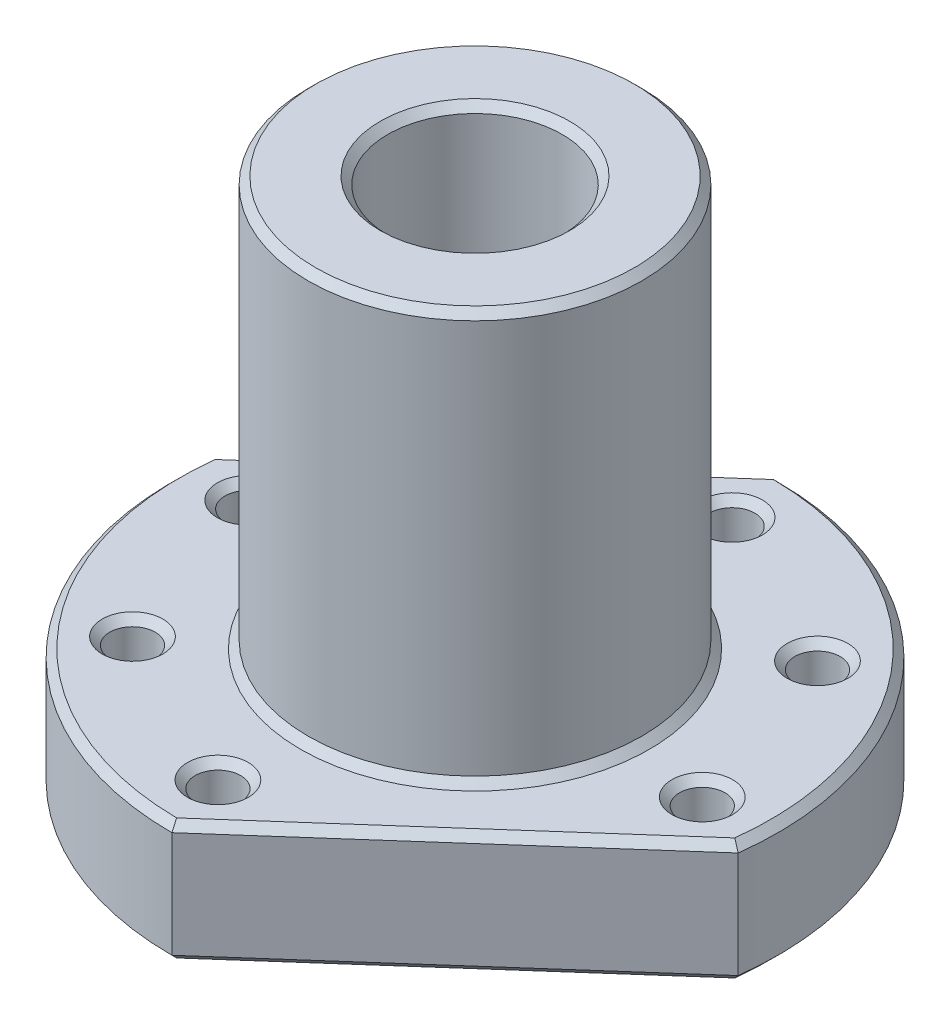
ISO-10303-21;
HEADER;
FILE_DESCRIPTION(('STEP AP214'),'2;1');
FILE_NAME('part.step','',(''),(''),'','','');
FILE_SCHEMA(('AUTOMOTIVE_DESIGN { 1 0 10303 214 1 1 1 1 }'));
ENDSEC;
DATA;
#1=APPLICATION_CONTEXT('core data for automotive mechanical design processes');
#2=APPLICATION_PROTOCOL_DEFINITION('international standard','automotive_design',2000,#1);
#3=PRODUCT_CONTEXT('',#1,'mechanical');
#4=PRODUCT('Part','Part','',(#3));
#5=PRODUCT_RELATED_PRODUCT_CATEGORY('part','',(#4));
#6=PRODUCT_DEFINITION_FORMATION('','',#4);
#7=PRODUCT_DEFINITION_CONTEXT('part definition',#1,'design');
#8=PRODUCT_DEFINITION('design','',#6,#7);
#9=PRODUCT_DEFINITION_SHAPE('','',#8);
#10=(LENGTH_UNIT() NAMED_UNIT(*) SI_UNIT(.MILLI.,.METRE.));
#11=(NAMED_UNIT(*) PLANE_ANGLE_UNIT() SI_UNIT($,.RADIAN.));
#12=(NAMED_UNIT(*) SI_UNIT($,.STERADIAN.) SOLID_ANGLE_UNIT());
#13=UNCERTAINTY_MEASURE_WITH_UNIT(LENGTH_MEASURE(1.E-05),#10,'distance_accuracy_value','');
#14=(GEOMETRIC_REPRESENTATION_CONTEXT(3) GLOBAL_UNCERTAINTY_ASSIGNED_CONTEXT((#13)) GLOBAL_UNIT_ASSIGNED_CONTEXT((#10,
#11,#12)) REPRESENTATION_CONTEXT('',''));
#15=CARTESIAN_POINT('',(0.,0.,0.));
#16=DIRECTION('',(0.,0.,1.));
#17=DIRECTION('',(1.,0.,0.));
#18=AXIS2_PLACEMENT_3D('',#15,#16,#17);
#19=CARTESIAN_POINT('',(0.,8.,0.));
#20=DIRECTION('',(0.,1.,0.));
#21=DIRECTION('',(0.,0.,1.));
#22=AXIS2_PLACEMENT_3D('',#19,#20,#21);
#23=PLANE('',#22);
#24=DIRECTION('',(-0.749599603554086,0.,0.661891557848835));
#25=VECTOR('',#24,1.);
#26=CARTESIAN_POINT('',(-19.5136982581917,8.,-2.11319196672854));
#27=LINE('',#26,#25);
#28=CARTESIAN_POINT('',(0.176155488049384,8.,-19.4992043233571));
#29=VERTEX_POINT('',#28);
#30=CARTESIAN_POINT('',(-19.3710106656656,8.,-2.23918417971134));
#31=VERTEX_POINT('',#30);
#32=EDGE_CURVE('E55',#29,#31,#27,.T.);
#33=ORIENTED_EDGE('',*,*,#32,.T.);
#34=CARTESIAN_POINT('',(0.,8.,0.));
#35=DIRECTION('',(0.,1.,0.));
#36=DIRECTION('',(0.,0.,1.));
#37=AXIS2_PLACEMENT_3D('',#34,#35,#36);
#38=CIRCLE('',#37,19.5);
#39=CARTESIAN_POINT('',(-0.176155488049398,8.,19.4992043233571));
#40=VERTEX_POINT('',#39);
#41=EDGE_CURVE('E250',#31,#40,#38,.T.);
#42=ORIENTED_EDGE('',*,*,#41,.T.);
#43=DIRECTION('',(0.749599603554086,0.,-0.661891557848835));
#44=VECTOR('',#43,1.);
#45=CARTESIAN_POINT('',(19.5136982581917,8.,2.11319196672854));
#46=LINE('',#45,#44);
#47=CARTESIAN_POINT('',(19.3710106656656,8.,2.23918417971133));
#48=VERTEX_POINT('',#47);
#49=EDGE_CURVE('E246',#40,#48,#46,.T.);
#50=ORIENTED_EDGE('',*,*,#49,.T.);
#51=CARTESIAN_POINT('',(0.,8.,0.));
#52=DIRECTION('',(0.,1.,0.));
#53=DIRECTION('',(0.,0.,1.));
#54=AXIS2_PLACEMENT_3D('',#51,#52,#53);
#55=CIRCLE('',#54,19.5);
#56=EDGE_CURVE('E60',#48,#29,#55,.T.);
#57=ORIENTED_EDGE('',*,*,#56,.T.);
#58=EDGE_LOOP('',(#33,#42,#50,#57));
#59=FACE_BOUND('',#58,.T.);
#60=CARTESIAN_POINT('',(0.,8.,0.));
#61=DIRECTION('',(0.,1.,0.));
#62=DIRECTION('',(0.,0.,1.));
#63=AXIS2_PLACEMENT_3D('',#60,#61,#62);
#64=CIRCLE('',#63,11.5);
#65=CARTESIAN_POINT('',(0.,8.,11.5));
#66=VERTEX_POINT('',#65);
#67=EDGE_CURVE('E243',#66,#66,#64,.F.);
#68=ORIENTED_EDGE('',*,*,#67,.T.);
#69=EDGE_LOOP('',(#68));
#70=FACE_BOUND('',#69,.T.);
#71=CARTESIAN_POINT('',(0.983422310714964,8.,-15.9697489197166));
#72=DIRECTION('',(0.,1.,0.));
#73=DIRECTION('',(0.,0.,1.));
#74=AXIS2_PLACEMENT_3D('',#71,#72,#73);
#75=CIRCLE('',#74,1.99999999999999);
#76=CARTESIAN_POINT('',(0.983422310714964,8.,-13.9697489197166));
#77=VERTEX_POINT('',#76);
#78=EDGE_CURVE('E240',#77,#77,#75,.F.);
#79=ORIENTED_EDGE('',*,*,#78,.T.);
#80=EDGE_LOOP('',(#79));
#81=FACE_BOUND('',#80,.T.);
#82=CARTESIAN_POINT('',(11.987702339655,8.,-10.5969331703019));
#83=DIRECTION('',(0.,1.,0.));
#84=DIRECTION('',(0.,0.,1.));
#85=AXIS2_PLACEMENT_3D('',#82,#83,#84);
#86=CIRCLE('',#85,2.00000000000004);
#87=CARTESIAN_POINT('',(11.987702339655,8.,-8.59693317030186));
#88=VERTEX_POINT('',#87);
#89=EDGE_CURVE('E237',#88,#88,#86,.F.);
#90=ORIENTED_EDGE('',*,*,#89,.T.);
#91=EDGE_LOOP('',(#90));
#92=FACE_BOUND('',#91,.T.);
#93=CARTESIAN_POINT('',(15.9697489197173,8.,0.983422310714324));
#94=DIRECTION('',(0.,1.,0.));
#95=DIRECTION('',(0.,0.,1.));
#96=AXIS2_PLACEMENT_3D('',#93,#94,#95);
#97=CIRCLE('',#96,2.00000000000047);
#98=CARTESIAN_POINT('',(15.9697489197173,8.,2.98342231071479));
#99=VERTEX_POINT('',#98);
#100=EDGE_CURVE('E234',#99,#99,#97,.F.);
#101=ORIENTED_EDGE('',*,*,#100,.T.);
#102=EDGE_LOOP('',(#101));
#103=FACE_BOUND('',#102,.T.);
#104=CARTESIAN_POINT('',(-0.983422310713593,8.,15.9697489197166));
#105=DIRECTION('',(0.,1.,0.));
#106=DIRECTION('',(0.,0.,1.));
#107=AXIS2_PLACEMENT_3D('',#104,#105,#106);
#108=CIRCLE('',#107,2.00000000000139);
#109=CARTESIAN_POINT('',(-0.983422310713593,8.,17.969748919718));
#110=VERTEX_POINT('',#109);
#111=EDGE_CURVE('E231',#110,#110,#108,.F.);
#112=ORIENTED_EDGE('',*,*,#111,.T.);
#113=EDGE_LOOP('',(#112));
#114=FACE_BOUND('',#113,.T.);
#115=CARTESIAN_POINT('',(-11.9877023396537,8.,10.596933170302));
#116=DIRECTION('',(0.,1.,0.));
#117=DIRECTION('',(0.,0.,1.));
#118=AXIS2_PLACEMENT_3D('',#115,#116,#117);
#119=CIRCLE('',#118,2.00000000000141);
#120=CARTESIAN_POINT('',(-11.9877023396537,8.,12.5969331703034));
#121=VERTEX_POINT('',#120);
#122=EDGE_CURVE('E228',#121,#121,#119,.F.);
#123=ORIENTED_EDGE('',*,*,#122,.T.);
#124=EDGE_LOOP('',(#123));
#125=FACE_BOUND('',#124,.T.);
#126=CARTESIAN_POINT('',(-15.9697489197159,8.,-0.983422310714232));
#127=DIRECTION('',(0.,1.,0.));
#128=DIRECTION('',(0.,0.,1.));
#129=AXIS2_PLACEMENT_3D('',#126,#127,#128);
#130=CIRCLE('',#129,2.00000000000106);
#131=CARTESIAN_POINT('',(-15.9697489197159,8.,1.01657768928683));
#132=VERTEX_POINT('',#131);
#133=EDGE_CURVE('E225',#132,#132,#130,.F.);
#134=ORIENTED_EDGE('',*,*,#133,.T.);
#135=EDGE_LOOP('',(#134));
#136=FACE_BOUND('',#135,.T.);
#137=ADVANCED_FACE('F33',(#59,#70,#81,#92,#103,#114,#125,#136),#23,.T.);
#138=CARTESIAN_POINT('',(6.0856107622216,8.,-25.3842375284762));
#139=DIRECTION('',(0.661891557848835,0.,0.749599603554086));
#140=DIRECTION('',(0.749599603554086,0.,-0.661891557848835));
#141=AXIS2_PLACEMENT_3D('',#138,#139,#140);
#142=PLANE('',#141);
#143=DIRECTION('',(0.,1.,0.));
#144=VECTOR('',#143,1.);
#145=CARTESIAN_POINT('',(-0.012102698348929,-19.,-19.999996338117));
#146=LINE('',#145,#144);
#147=CARTESIAN_POINT('',(-0.012102698348929,0.499999999999994,-19.999996338117));
#148=VERTEX_POINT('',#147);
#149=CARTESIAN_POINT('',(-0.012102698348929,7.49999999999999,-19.999996338117));
#150=VERTEX_POINT('',#149);
#151=EDGE_CURVE('E109',#148,#150,#146,.T.);
#152=ORIENTED_EDGE('',*,*,#151,.F.);
#153=DIRECTION('',(-0.749599603554086,0.,0.661891557848835));
#154=VECTOR('',#153,1.);
#155=CARTESIAN_POINT('',(6.0856107622216,0.499999999999995,-25.3842375284762));
#156=LINE('',#155,#154);
#157=CARTESIAN_POINT('',(-19.8446440371161,0.499999999999994,-2.48799176850559));
#158=VERTEX_POINT('',#157);
#159=EDGE_CURVE('E125',#148,#158,#156,.T.);
#160=ORIENTED_EDGE('',*,*,#159,.T.);
#161=DIRECTION('',(0.,1.,0.));
#162=VECTOR('',#161,1.);
#163=CARTESIAN_POINT('',(-19.8446440371161,-19.,-2.48799176850559));
#164=LINE('',#163,#162);
#165=CARTESIAN_POINT('',(-19.8446440371161,7.49999999999999,-2.48799176850559));
#166=VERTEX_POINT('',#165);
#167=EDGE_CURVE('E343',#166,#158,#164,.F.);
#168=ORIENTED_EDGE('',*,*,#167,.F.);
#169=DIRECTION('',(0.749599603554086,0.,-0.661891557848835));
#170=VECTOR('',#169,1.);
#171=CARTESIAN_POINT('',(-0.0121026983489287,7.49999999999999,-19.999996338117));
#172=LINE('',#171,#170);
#173=EDGE_CURVE('E128',#166,#150,#172,.T.);
#174=ORIENTED_EDGE('',*,*,#173,.T.);
#175=EDGE_LOOP('',(#152,#160,#168,#174));
#176=FACE_BOUND('',#175,.T.);
#177=ADVANCED_FACE('F122',(#176),#142,.F.);
#178=CARTESIAN_POINT('',(25.9423574976867,8.,-2.89624942185361));
#179=DIRECTION('',(-0.661891557848835,0.,-0.749599603554086));
#180=DIRECTION('',(-0.749599603554086,0.,0.661891557848835));
#181=AXIS2_PLACEMENT_3D('',#178,#179,#180);
#182=PLANE('',#181);
#183=DIRECTION('',(0.,1.,0.));
#184=VECTOR('',#183,1.);
#185=CARTESIAN_POINT('',(0.0121026983489238,-19.,19.999996338117));
#186=LINE('',#185,#184);
#187=CARTESIAN_POINT('',(0.0121026983489238,0.499999999999994,19.999996338117));
#188=VERTEX_POINT('',#187);
#189=CARTESIAN_POINT('',(0.0121026983489238,7.49999999999998,19.999996338117));
#190=VERTEX_POINT('',#189);
#191=EDGE_CURVE('E290',#188,#190,#186,.T.);
#192=ORIENTED_EDGE('',*,*,#191,.F.);
#193=DIRECTION('',(0.749599603554086,0.,-0.661891557848835));
#194=VECTOR('',#193,1.);
#195=CARTESIAN_POINT('',(25.9423574976867,0.499999999999993,-2.89624942185361));
#196=LINE('',#195,#194);
#197=CARTESIAN_POINT('',(19.8446440371161,0.499999999999994,2.48799176850559));
#198=VERTEX_POINT('',#197);
#199=EDGE_CURVE('E181',#188,#198,#196,.T.);
#200=ORIENTED_EDGE('',*,*,#199,.T.);
#201=DIRECTION('',(0.,1.,0.));
#202=VECTOR('',#201,1.);
#203=CARTESIAN_POINT('',(19.8446440371161,-19.,2.48799176850559));
#204=LINE('',#203,#202);
#205=CARTESIAN_POINT('',(19.8446440371161,7.49999999999998,2.48799176850559));
#206=VERTEX_POINT('',#205);
#207=EDGE_CURVE('E112',#206,#198,#204,.F.);
#208=ORIENTED_EDGE('',*,*,#207,.F.);
#209=DIRECTION('',(-0.749599603554086,0.,0.661891557848835));
#210=VECTOR('',#209,1.);
#211=CARTESIAN_POINT('',(0.0121026983489211,7.49999999999998,19.999996338117));
#212=LINE('',#211,#210);
#213=EDGE_CURVE('E179',#206,#190,#212,.T.);
#214=ORIENTED_EDGE('',*,*,#213,.T.);
#215=EDGE_LOOP('',(#192,#200,#208,#214));
#216=FACE_BOUND('',#215,.T.);
#217=ADVANCED_FACE('F350',(#216),#182,.F.);
#218=CARTESIAN_POINT('',(0.,0.,0.));
#219=DIRECTION('',(0.,1.,0.));
#220=DIRECTION('',(0.,0.,1.));
#221=AXIS2_PLACEMENT_3D('',#218,#219,#220);
#222=PLANE('',#221);
#223=CARTESIAN_POINT('',(0.,0.,0.));
#224=DIRECTION('',(0.,1.,0.));
#225=DIRECTION('',(0.,0.,1.));
#226=AXIS2_PLACEMENT_3D('',#223,#224,#225);
#227=CIRCLE('',#226,19.5);
#228=CARTESIAN_POINT('',(-0.176155488049394,0.,19.4992043233571));
#229=VERTEX_POINT('',#228);
#230=CARTESIAN_POINT('',(-19.3710106656656,0.,-2.23918417971135));
#231=VERTEX_POINT('',#230);
#232=EDGE_CURVE('E170',#229,#231,#227,.F.);
#233=ORIENTED_EDGE('',*,*,#232,.T.);
#234=DIRECTION('',(0.749599603554086,0.,-0.661891557848835));
#235=VECTOR('',#234,1.);
#236=CARTESIAN_POINT('',(-9.59742758880811,0.,-10.8691942515342));
#237=LINE('',#236,#235);
#238=CARTESIAN_POINT('',(0.176155488049382,0.,-19.4992043233571));
#239=VERTEX_POINT('',#238);
#240=EDGE_CURVE('E172',#231,#239,#237,.T.);
#241=ORIENTED_EDGE('',*,*,#240,.T.);
#242=CARTESIAN_POINT('',(0.,0.,0.));
#243=DIRECTION('',(0.,1.,0.));
#244=DIRECTION('',(0.,0.,1.));
#245=AXIS2_PLACEMENT_3D('',#242,#243,#244);
#246=CIRCLE('',#245,19.5);
#247=CARTESIAN_POINT('',(19.3710106656656,0.,2.23918417971134));
#248=VERTEX_POINT('',#247);
#249=EDGE_CURVE('E133',#239,#248,#246,.F.);
#250=ORIENTED_EDGE('',*,*,#249,.T.);
#251=DIRECTION('',(-0.749599603554086,0.,0.661891557848835));
#252=VECTOR('',#251,1.);
#253=CARTESIAN_POINT('',(9.5974275888081,0.,10.8691942515342));
#254=LINE('',#253,#252);
#255=EDGE_CURVE('E168',#248,#229,#254,.T.);
#256=ORIENTED_EDGE('',*,*,#255,.T.);
#257=EDGE_LOOP('',(#233,#241,#250,#256));
#258=FACE_BOUND('',#257,.T.);
#259=CARTESIAN_POINT('',(0.,0.,0.));
#260=DIRECTION('',(0.,1.,0.));
#261=DIRECTION('',(0.,0.,1.));
#262=AXIS2_PLACEMENT_3D('',#259,#260,#261);
#263=CIRCLE('',#262,6.25);
#264=CARTESIAN_POINT('',(0.,0.,6.25));
#265=VERTEX_POINT('',#264);
#266=EDGE_CURVE('E164',#265,#265,#263,.T.);
#267=ORIENTED_EDGE('',*,*,#266,.T.);
#268=EDGE_LOOP('',(#267));
#269=FACE_BOUND('',#268,.T.);
#270=CARTESIAN_POINT('',(0.983422310714964,0.,-15.9697489197166));
#271=DIRECTION('',(0.,1.,0.));
#272=DIRECTION('',(0.,0.,1.));
#273=AXIS2_PLACEMENT_3D('',#270,#271,#272);
#274=CIRCLE('',#273,2.00000000000001);
#275=CARTESIAN_POINT('',(0.983422310714964,0.,-13.9697489197165));
#276=VERTEX_POINT('',#275);
#277=EDGE_CURVE('E161',#276,#276,#274,.T.);
#278=ORIENTED_EDGE('',*,*,#277,.T.);
#279=EDGE_LOOP('',(#278));
#280=FACE_BOUND('',#279,.T.);
#281=CARTESIAN_POINT('',(11.987702339655,0.,-10.5969331703019));
#282=DIRECTION('',(0.,1.,0.));
#283=DIRECTION('',(0.,0.,1.));
#284=AXIS2_PLACEMENT_3D('',#281,#282,#283);
#285=CIRCLE('',#284,2.00000000000004);
#286=CARTESIAN_POINT('',(11.987702339655,0.,-8.59693317030185));
#287=VERTEX_POINT('',#286);
#288=EDGE_CURVE('E158',#287,#287,#285,.T.);
#289=ORIENTED_EDGE('',*,*,#288,.T.);
#290=EDGE_LOOP('',(#289));
#291=FACE_BOUND('',#290,.T.);
#292=CARTESIAN_POINT('',(15.9697489197173,0.,0.983422310714324));
#293=DIRECTION('',(0.,1.,0.));
#294=DIRECTION('',(0.,0.,1.));
#295=AXIS2_PLACEMENT_3D('',#292,#293,#294);
#296=CIRCLE('',#295,2.00000000000046);
#297=CARTESIAN_POINT('',(15.9697489197173,0.,2.98342231071478));
#298=VERTEX_POINT('',#297);
#299=EDGE_CURVE('E155',#298,#298,#296,.T.);
#300=ORIENTED_EDGE('',*,*,#299,.T.);
#301=EDGE_LOOP('',(#300));
#302=FACE_BOUND('',#301,.T.);
#303=CARTESIAN_POINT('',(-0.983422310713593,0.,15.9697489197166));
#304=DIRECTION('',(0.,1.,0.));
#305=DIRECTION('',(0.,0.,1.));
#306=AXIS2_PLACEMENT_3D('',#303,#304,#305);
#307=CIRCLE('',#306,2.00000000000138);
#308=CARTESIAN_POINT('',(-0.983422310713593,0.,17.969748919718));
#309=VERTEX_POINT('',#308);
#310=EDGE_CURVE('E152',#309,#309,#307,.T.);
#311=ORIENTED_EDGE('',*,*,#310,.T.);
#312=EDGE_LOOP('',(#311));
#313=FACE_BOUND('',#312,.T.);
#314=CARTESIAN_POINT('',(-11.9877023396537,0.,10.596933170302));
#315=DIRECTION('',(0.,1.,0.));
#316=DIRECTION('',(0.,0.,1.));
#317=AXIS2_PLACEMENT_3D('',#314,#315,#316);
#318=CIRCLE('',#317,2.00000000000138);
#319=CARTESIAN_POINT('',(-11.9877023396537,0.,12.5969331703034));
#320=VERTEX_POINT('',#319);
#321=EDGE_CURVE('E146',#320,#320,#318,.T.);
#322=ORIENTED_EDGE('',*,*,#321,.T.);
#323=EDGE_LOOP('',(#322));
#324=FACE_BOUND('',#323,.T.);
#325=CARTESIAN_POINT('',(-15.9697489197159,0.,-0.983422310714232));
#326=DIRECTION('',(0.,1.,0.));
#327=DIRECTION('',(0.,0.,1.));
#328=AXIS2_PLACEMENT_3D('',#325,#326,#327);
#329=CIRCLE('',#328,2.00000000000105);
#330=CARTESIAN_POINT('',(-15.9697489197159,0.,1.01657768928682));
#331=VERTEX_POINT('',#330);
#332=EDGE_CURVE('E143',#331,#331,#329,.T.);
#333=ORIENTED_EDGE('',*,*,#332,.T.);
#334=EDGE_LOOP('',(#333));
#335=FACE_BOUND('',#334,.T.);
#336=ADVANCED_FACE('F358',(#258,#269,#280,#291,#302,#313,#324,#335),#222,.F.);
#337=CARTESIAN_POINT('',(0.,35.,0.));
#338=DIRECTION('',(0.,1.,0.));
#339=DIRECTION('',(0.,0.,1.));
#340=AXIS2_PLACEMENT_3D('',#337,#338,#339);
#341=PLANE('',#340);
#342=CARTESIAN_POINT('',(0.,35.,0.));
#343=DIRECTION('',(0.,1.,0.));
#344=DIRECTION('',(0.,0.,1.));
#345=AXIS2_PLACEMENT_3D('',#342,#343,#344);
#346=CIRCLE('',#345,6.24999999999998);
#347=CARTESIAN_POINT('',(0.,35.,6.24999999999998));
#348=VERTEX_POINT('',#347);
#349=EDGE_CURVE('E11',#348,#348,#346,.F.);
#350=ORIENTED_EDGE('',*,*,#349,.T.);
#351=EDGE_LOOP('',(#350));
#352=FACE_BOUND('',#351,.T.);
#353=CARTESIAN_POINT('',(0.,35.,0.));
#354=DIRECTION('',(0.,1.,0.));
#355=DIRECTION('',(0.,0.,1.));
#356=AXIS2_PLACEMENT_3D('',#353,#354,#355);
#357=CIRCLE('',#356,10.5);
#358=CARTESIAN_POINT('',(0.,35.,10.5));
#359=VERTEX_POINT('',#358);
#360=EDGE_CURVE('E47',#359,#359,#357,.T.);
#361=ORIENTED_EDGE('',*,*,#360,.T.);
#362=EDGE_LOOP('',(#361));
#363=FACE_BOUND('',#362,.T.);
#364=ADVANCED_FACE('F361',(#352,#363),#341,.T.);
#365=CARTESIAN_POINT('',(0.,35.,0.));
#366=DIRECTION('',(0.,-1.,0.));
#367=DIRECTION('',(0.,0.,-1.));
#368=AXIS2_PLACEMENT_3D('',#365,#366,#367);
#369=CYLINDRICAL_SURFACE('',#368,11.);
#370=CARTESIAN_POINT('',(0.,8.49999999999999,0.));
#371=DIRECTION('',(0.,1.,0.));
#372=DIRECTION('',(0.,0.,1.));
#373=AXIS2_PLACEMENT_3D('',#370,#371,#372);
#374=CIRCLE('',#373,11.);
#375=CARTESIAN_POINT('',(0.,8.49999999999999,11.));
#376=VERTEX_POINT('',#375);
#377=EDGE_CURVE('E255',#376,#376,#374,.T.);
#378=ORIENTED_EDGE('',*,*,#377,.T.);
#379=EDGE_LOOP('',(#378));
#380=FACE_BOUND('',#379,.T.);
#381=CARTESIAN_POINT('',(0.,34.5,0.));
#382=DIRECTION('',(0.,1.,0.));
#383=DIRECTION('',(0.,0.,1.));
#384=AXIS2_PLACEMENT_3D('',#381,#382,#383);
#385=CIRCLE('',#384,11.);
#386=CARTESIAN_POINT('',(0.,34.5,11.));
#387=VERTEX_POINT('',#386);
#388=EDGE_CURVE('E252',#387,#387,#385,.F.);
#389=ORIENTED_EDGE('',*,*,#388,.T.);
#390=EDGE_LOOP('',(#389));
#391=FACE_BOUND('',#390,.T.);
#392=ADVANCED_FACE('F394',(#380,#391),#369,.T.);
#393=CARTESIAN_POINT('',(0.,35.,0.));
#394=DIRECTION('',(0.,-1.,0.));
#395=DIRECTION('',(0.,0.,-1.));
#396=AXIS2_PLACEMENT_3D('',#393,#394,#395);
#397=CYLINDRICAL_SURFACE('',#396,5.75);
#398=CARTESIAN_POINT('',(0.,0.5,0.));
#399=DIRECTION('',(0.,1.,0.));
#400=DIRECTION('',(0.,0.,1.));
#401=AXIS2_PLACEMENT_3D('',#398,#399,#400);
#402=CIRCLE('',#401,5.75);
#403=CARTESIAN_POINT('',(0.,0.5,5.75));
#404=VERTEX_POINT('',#403);
#405=EDGE_CURVE('E186',#404,#404,#402,.F.);
#406=ORIENTED_EDGE('',*,*,#405,.T.);
#407=EDGE_LOOP('',(#406));
#408=FACE_BOUND('',#407,.T.);
#409=CARTESIAN_POINT('',(0.,34.5,0.));
#410=DIRECTION('',(0.,1.,0.));
#411=DIRECTION('',(0.,0.,1.));
#412=AXIS2_PLACEMENT_3D('',#409,#410,#411);
#413=CIRCLE('',#412,5.75);
#414=CARTESIAN_POINT('',(0.,34.5,5.75));
#415=VERTEX_POINT('',#414);
#416=EDGE_CURVE('E117',#415,#415,#413,.T.);
#417=ORIENTED_EDGE('',*,*,#416,.T.);
#418=EDGE_LOOP('',(#417));
#419=FACE_BOUND('',#418,.T.);
#420=ADVANCED_FACE('F418',(#408,#419),#397,.F.);
#421=CARTESIAN_POINT('',(0.,-19.,0.));
#422=DIRECTION('',(0.,1.,0.));
#423=DIRECTION('',(0.,0.,1.));
#424=AXIS2_PLACEMENT_3D('',#421,#422,#423);
#425=CYLINDRICAL_SURFACE('',#424,20.);
#426=ORIENTED_EDGE('',*,*,#167,.T.);
#427=CARTESIAN_POINT('',(0.,0.499999999999994,0.));
#428=DIRECTION('',(0.,1.,0.));
#429=DIRECTION('',(0.,0.,1.));
#430=AXIS2_PLACEMENT_3D('',#427,#428,#429);
#431=CIRCLE('',#430,20.);
#432=EDGE_CURVE('E177',#158,#188,#431,.T.);
#433=ORIENTED_EDGE('',*,*,#432,.T.);
#434=ORIENTED_EDGE('',*,*,#191,.T.);
#435=CARTESIAN_POINT('',(0.,7.49999999999999,0.));
#436=DIRECTION('',(0.,1.,0.));
#437=DIRECTION('',(0.,0.,1.));
#438=AXIS2_PLACEMENT_3D('',#435,#436,#437);
#439=CIRCLE('',#438,20.);
#440=EDGE_CURVE('E174',#190,#166,#439,.F.);
#441=ORIENTED_EDGE('',*,*,#440,.T.);
#442=EDGE_LOOP('',(#426,#433,#434,#441));
#443=FACE_BOUND('',#442,.T.);
#444=ADVANCED_FACE('F342',(#443),#425,.T.);
#445=ORIENTED_EDGE('',*,*,#207,.T.);
#446=CARTESIAN_POINT('',(0.,0.499999999999994,0.));
#447=DIRECTION('',(0.,1.,0.));
#448=DIRECTION('',(0.,0.,1.));
#449=AXIS2_PLACEMENT_3D('',#446,#447,#448);
#450=CIRCLE('',#449,20.);
#451=EDGE_CURVE('E106',#198,#148,#450,.T.);
#452=ORIENTED_EDGE('',*,*,#451,.T.);
#453=ORIENTED_EDGE('',*,*,#151,.T.);
#454=CARTESIAN_POINT('',(0.,7.49999999999999,0.));
#455=DIRECTION('',(0.,1.,0.));
#456=DIRECTION('',(0.,0.,1.));
#457=AXIS2_PLACEMENT_3D('',#454,#455,#456);
#458=CIRCLE('',#457,20.);
#459=EDGE_CURVE('E118',#150,#206,#458,.F.);
#460=ORIENTED_EDGE('',*,*,#459,.T.);
#461=EDGE_LOOP('',(#445,#452,#453,#460));
#462=FACE_BOUND('',#461,.T.);
#463=ADVANCED_FACE('F108',(#462),#425,.T.);
#464=CARTESIAN_POINT('',(0.983422310714964,0.,-15.9697489197166));
#465=DIRECTION('',(0.,1.,0.));
#466=DIRECTION('',(0.,0.,1.));
#467=AXIS2_PLACEMENT_3D('',#464,#465,#466);
#468=CYLINDRICAL_SURFACE('',#467,1.5);
#469=CARTESIAN_POINT('',(0.983422310714964,0.500000000000007,-15.9697489197166));
#470=DIRECTION('',(0.,1.,0.));
#471=DIRECTION('',(0.,0.,1.));
#472=AXIS2_PLACEMENT_3D('',#469,#470,#471);
#473=CIRCLE('',#472,1.5);
#474=CARTESIAN_POINT('',(0.983422310714964,0.500000000000007,-14.4697489197166));
#475=VERTEX_POINT('',#474);
#476=EDGE_CURVE('E192',#475,#475,#473,.F.);
#477=ORIENTED_EDGE('',*,*,#476,.T.);
#478=EDGE_LOOP('',(#477));
#479=FACE_BOUND('',#478,.T.);
#480=CARTESIAN_POINT('',(0.983422310714964,7.50000000000001,-15.9697489197166));
#481=DIRECTION('',(0.,1.,0.));
#482=DIRECTION('',(0.,0.,1.));
#483=AXIS2_PLACEMENT_3D('',#480,#481,#482);
#484=CIRCLE('',#483,1.5);
#485=CARTESIAN_POINT('',(0.983422310714964,7.50000000000001,-14.4697489197166));
#486=VERTEX_POINT('',#485);
#487=EDGE_CURVE('E189',#486,#486,#484,.T.);
#488=ORIENTED_EDGE('',*,*,#487,.T.);
#489=EDGE_LOOP('',(#488));
#490=FACE_BOUND('',#489,.T.);
#491=ADVANCED_FACE('F438',(#479,#490),#468,.F.);
#492=CARTESIAN_POINT('',(11.987702339655,0.,-10.5969331703019));
#493=DIRECTION('',(0.,1.,0.));
#494=DIRECTION('',(0.,0.,1.));
#495=AXIS2_PLACEMENT_3D('',#492,#493,#494);
#496=CYLINDRICAL_SURFACE('',#495,1.50000000000005);
#497=CARTESIAN_POINT('',(11.987702339655,0.500000000000007,-10.5969331703019));
#498=DIRECTION('',(0.,1.,0.));
#499=DIRECTION('',(0.,0.,1.));
#500=AXIS2_PLACEMENT_3D('',#497,#498,#499);
#501=CIRCLE('',#500,1.50000000000005);
#502=CARTESIAN_POINT('',(11.987702339655,0.500000000000007,-9.09693317030185));
#503=VERTEX_POINT('',#502);
#504=EDGE_CURVE('E198',#503,#503,#501,.F.);
#505=ORIENTED_EDGE('',*,*,#504,.T.);
#506=EDGE_LOOP('',(#505));
#507=FACE_BOUND('',#506,.T.);
#508=CARTESIAN_POINT('',(11.987702339655,7.50000000000001,-10.5969331703019));
#509=DIRECTION('',(0.,1.,0.));
#510=DIRECTION('',(0.,0.,1.));
#511=AXIS2_PLACEMENT_3D('',#508,#509,#510);
#512=CIRCLE('',#511,1.50000000000005);
#513=CARTESIAN_POINT('',(11.987702339655,7.50000000000001,-9.09693317030185));
#514=VERTEX_POINT('',#513);
#515=EDGE_CURVE('E195',#514,#514,#512,.T.);
#516=ORIENTED_EDGE('',*,*,#515,.T.);
#517=EDGE_LOOP('',(#516));
#518=FACE_BOUND('',#517,.T.);
#519=ADVANCED_FACE('F444',(#507,#518),#496,.F.);
#520=CARTESIAN_POINT('',(15.9697489197173,0.,0.983422310714324));
#521=DIRECTION('',(0.,1.,0.));
#522=DIRECTION('',(0.,0.,1.));
#523=AXIS2_PLACEMENT_3D('',#520,#521,#522);
#524=CYLINDRICAL_SURFACE('',#523,1.50000000000045);
#525=CARTESIAN_POINT('',(15.9697489197173,0.500000000000007,0.983422310714324));
#526=DIRECTION('',(0.,1.,0.));
#527=DIRECTION('',(0.,0.,1.));
#528=AXIS2_PLACEMENT_3D('',#525,#526,#527);
#529=CIRCLE('',#528,1.50000000000045);
#530=CARTESIAN_POINT('',(15.9697489197173,0.500000000000007,2.48342231071478));
#531=VERTEX_POINT('',#530);
#532=EDGE_CURVE('E204',#531,#531,#529,.F.);
#533=ORIENTED_EDGE('',*,*,#532,.T.);
#534=EDGE_LOOP('',(#533));
#535=FACE_BOUND('',#534,.T.);
#536=CARTESIAN_POINT('',(15.9697489197173,7.49999999999999,0.983422310714324));
#537=DIRECTION('',(0.,1.,0.));
#538=DIRECTION('',(0.,0.,1.));
#539=AXIS2_PLACEMENT_3D('',#536,#537,#538);
#540=CIRCLE('',#539,1.50000000000045);
#541=CARTESIAN_POINT('',(15.9697489197173,7.49999999999999,2.48342231071478));
#542=VERTEX_POINT('',#541);
#543=EDGE_CURVE('E201',#542,#542,#540,.T.);
#544=ORIENTED_EDGE('',*,*,#543,.T.);
#545=EDGE_LOOP('',(#544));
#546=FACE_BOUND('',#545,.T.);
#547=ADVANCED_FACE('F452',(#535,#546),#524,.F.);
#548=CARTESIAN_POINT('',(-0.983422310713593,0.,15.9697489197166));
#549=DIRECTION('',(0.,1.,0.));
#550=DIRECTION('',(0.,0.,1.));
#551=AXIS2_PLACEMENT_3D('',#548,#549,#550);
#552=CYLINDRICAL_SURFACE('',#551,1.50000000000139);
#553=CARTESIAN_POINT('',(-0.983422310713593,0.499999999999995,15.9697489197166));
#554=DIRECTION('',(0.,1.,0.));
#555=DIRECTION('',(0.,0.,1.));
#556=AXIS2_PLACEMENT_3D('',#553,#554,#555);
#557=CIRCLE('',#556,1.50000000000139);
#558=CARTESIAN_POINT('',(-0.983422310713593,0.499999999999995,17.469748919718));
#559=VERTEX_POINT('',#558);
#560=EDGE_CURVE('E210',#559,#559,#557,.F.);
#561=ORIENTED_EDGE('',*,*,#560,.T.);
#562=EDGE_LOOP('',(#561));
#563=FACE_BOUND('',#562,.T.);
#564=CARTESIAN_POINT('',(-0.983422310713593,7.5,15.9697489197166));
#565=DIRECTION('',(0.,1.,0.));
#566=DIRECTION('',(0.,0.,1.));
#567=AXIS2_PLACEMENT_3D('',#564,#565,#566);
#568=CIRCLE('',#567,1.50000000000139);
#569=CARTESIAN_POINT('',(-0.983422310713593,7.5,17.469748919718));
#570=VERTEX_POINT('',#569);
#571=EDGE_CURVE('E207',#570,#570,#568,.T.);
#572=ORIENTED_EDGE('',*,*,#571,.T.);
#573=EDGE_LOOP('',(#572));
#574=FACE_BOUND('',#573,.T.);
#575=ADVANCED_FACE('F460',(#563,#574),#552,.F.);
#576=CARTESIAN_POINT('',(-11.9877023396537,0.,10.596933170302));
#577=DIRECTION('',(0.,1.,0.));
#578=DIRECTION('',(0.,0.,1.));
#579=AXIS2_PLACEMENT_3D('',#576,#577,#578);
#580=CYLINDRICAL_SURFACE('',#579,1.5000000000014);
#581=CARTESIAN_POINT('',(-11.9877023396537,0.499999999999983,10.596933170302));
#582=DIRECTION('',(0.,1.,0.));
#583=DIRECTION('',(0.,0.,1.));
#584=AXIS2_PLACEMENT_3D('',#581,#582,#583);
#585=CIRCLE('',#584,1.5000000000014);
#586=CARTESIAN_POINT('',(-11.9877023396537,0.499999999999983,12.0969331703034));
#587=VERTEX_POINT('',#586);
#588=EDGE_CURVE('E216',#587,#587,#585,.F.);
#589=ORIENTED_EDGE('',*,*,#588,.T.);
#590=EDGE_LOOP('',(#589));
#591=FACE_BOUND('',#590,.T.);
#592=CARTESIAN_POINT('',(-11.9877023396537,7.49999999999999,10.596933170302));
#593=DIRECTION('',(0.,1.,0.));
#594=DIRECTION('',(0.,0.,1.));
#595=AXIS2_PLACEMENT_3D('',#592,#593,#594);
#596=CIRCLE('',#595,1.5000000000014);
#597=CARTESIAN_POINT('',(-11.9877023396537,7.49999999999999,12.0969331703034));
#598=VERTEX_POINT('',#597);
#599=EDGE_CURVE('E213',#598,#598,#596,.T.);
#600=ORIENTED_EDGE('',*,*,#599,.T.);
#601=EDGE_LOOP('',(#600));
#602=FACE_BOUND('',#601,.T.);
#603=ADVANCED_FACE('F468',(#591,#602),#580,.F.);
#604=CARTESIAN_POINT('',(-15.9697489197159,0.,-0.983422310714232));
#605=DIRECTION('',(0.,1.,0.));
#606=DIRECTION('',(0.,0.,1.));
#607=AXIS2_PLACEMENT_3D('',#604,#605,#606);
#608=CYLINDRICAL_SURFACE('',#607,1.50000000000104);
#609=CARTESIAN_POINT('',(-15.9697489197159,0.500000000000007,-0.983422310714232));
#610=DIRECTION('',(0.,1.,0.));
#611=DIRECTION('',(0.,0.,1.));
#612=AXIS2_PLACEMENT_3D('',#609,#610,#611);
#613=CIRCLE('',#612,1.50000000000104);
#614=CARTESIAN_POINT('',(-15.9697489197159,0.500000000000007,0.516577689286813));
#615=VERTEX_POINT('',#614);
#616=EDGE_CURVE('E222',#615,#615,#613,.F.);
#617=ORIENTED_EDGE('',*,*,#616,.T.);
#618=EDGE_LOOP('',(#617));
#619=FACE_BOUND('',#618,.T.);
#620=CARTESIAN_POINT('',(-15.9697489197159,7.49999999999999,-0.983422310714232));
#621=DIRECTION('',(0.,1.,0.));
#622=DIRECTION('',(0.,0.,1.));
#623=AXIS2_PLACEMENT_3D('',#620,#621,#622);
#624=CIRCLE('',#623,1.50000000000104);
#625=CARTESIAN_POINT('',(-15.9697489197159,7.49999999999999,0.516577689286813));
#626=VERTEX_POINT('',#625);
#627=EDGE_CURVE('E219',#626,#626,#624,.T.);
#628=ORIENTED_EDGE('',*,*,#627,.T.);
#629=EDGE_LOOP('',(#628));
#630=FACE_BOUND('',#629,.T.);
#631=ADVANCED_FACE('F476',(#619,#630),#608,.F.);
#632=CARTESIAN_POINT('',(25.9423574976867,0.499999999999994,-2.89624942185361));
#633=DIRECTION('',(-0.468028008965035,0.707106781186554,-0.530046962847837));
#634=DIRECTION('',(0.749599603554086,0.,-0.661891557848835));
#635=AXIS2_PLACEMENT_3D('',#632,#633,#634);
#636=PLANE('',#635);
#637=CARTESIAN_POINT('',(0.0121026983489226,0.499999999999993,19.999996338117));
#638=CARTESIAN_POINT('',(-0.0194613646943151,0.416625862193423,19.9166423039758));
#639=CARTESIAN_POINT('',(-0.0509315782525103,0.333272127059538,19.8332326194462));
#640=CARTESIAN_POINT('',(-0.113684307055881,0.166605460392019,19.6663019478619));
#641=CARTESIAN_POINT('',(-0.144966822297126,0.0832925288592394,19.5827809608049));
#642=CARTESIAN_POINT('',(-0.176155488049397,0.,19.4992043233571));
#643=B_SPLINE_CURVE_WITH_KNOTS('',3,(#637,#638,#639,#640,#641,#642),.UNSPECIFIED.,.F.,.F.,(4,2,
4),(0.,0.366140075353099,0.732280158373687),.UNSPECIFIED.);
#644=EDGE_CURVE('E137',#229,#188,#643,.F.);
#645=ORIENTED_EDGE('',*,*,#644,.F.);
#646=ORIENTED_EDGE('',*,*,#255,.F.);
#647=CARTESIAN_POINT('',(19.8446440371161,0.499999999999993,2.48799176850559));
#648=CARTESIAN_POINT('',(19.7658388242452,0.416625862193426,2.44635136135381));
#649=CARTESIAN_POINT('',(19.6869667706028,0.333272127059542,2.40479719226126));
#650=CARTESIAN_POINT('',(19.5290889801221,0.166605460392024,2.32186132932622));
#651=CARTESIAN_POINT('',(19.450083243281,0.0832925288592436,2.28047963548736));
#652=CARTESIAN_POINT('',(19.3710106656656,0.,2.23918417971134));
#653=B_SPLINE_CURVE_WITH_KNOTS('',3,(#647,#648,#649,#650,#651,#652),.UNSPECIFIED.,.F.,.F.,(4,2,
4),(0.,0.366140075353098,0.732280158373687),.UNSPECIFIED.);
#654=EDGE_CURVE('E285',#198,#248,#653,.T.);
#655=ORIENTED_EDGE('',*,*,#654,.F.);
#656=ORIENTED_EDGE('',*,*,#199,.F.);
#657=EDGE_LOOP('',(#645,#646,#655,#656));
#658=FACE_BOUND('',#657,.T.);
#659=ADVANCED_FACE('F280',(#658),#636,.F.);
#660=CARTESIAN_POINT('',(0.,0.499999999999994,0.));
#661=DIRECTION('',(0.,1.,0.));
#662=DIRECTION('',(0.,0.,1.));
#663=AXIS2_PLACEMENT_3D('',#660,#661,#662);
#664=CONICAL_SURFACE('',#663,20.,0.785398163397455);
#665=ORIENTED_EDGE('',*,*,#654,.T.);
#666=ORIENTED_EDGE('',*,*,#249,.F.);
#667=CARTESIAN_POINT('',(0.176155488049382,0.,-19.4992043233571));
#668=CARTESIAN_POINT('',(0.144966822297119,0.0832925288592419,-19.5827809608049));
#669=CARTESIAN_POINT('',(0.113684307055879,0.166605460392022,-19.6663019478619));
#670=CARTESIAN_POINT('',(0.0509315782525131,0.333272127059541,-19.8332326194462));
#671=CARTESIAN_POINT('',(0.0194613646943169,0.416625862193426,-19.9166423039758));
#672=CARTESIAN_POINT('',(-0.0121026983489249,0.499999999999994,-19.999996338117));
#673=B_SPLINE_CURVE_WITH_KNOTS('',3,(#667,#668,#669,#670,#671,#672),.UNSPECIFIED.,.F.,.F.,(4,2,
4),(0.,0.366140083020588,0.732280158373686),.UNSPECIFIED.);
#674=EDGE_CURVE('E131',#148,#239,#673,.F.);
#675=ORIENTED_EDGE('',*,*,#674,.F.);
#676=ORIENTED_EDGE('',*,*,#451,.F.);
#677=EDGE_LOOP('',(#665,#666,#675,#676));
#678=FACE_BOUND('',#677,.T.);
#679=ADVANCED_FACE('F132',(#678),#664,.T.);
#680=CARTESIAN_POINT('',(0.,0.499999999999994,0.));
#681=DIRECTION('',(0.,1.,0.));
#682=DIRECTION('',(0.,0.,1.));
#683=AXIS2_PLACEMENT_3D('',#680,#681,#682);
#684=CONICAL_SURFACE('',#683,20.,0.785398163397455);
#685=ORIENTED_EDGE('',*,*,#644,.T.);
#686=ORIENTED_EDGE('',*,*,#432,.F.);
#687=CARTESIAN_POINT('',(-19.8446440371161,0.499999999999994,-2.48799176850559));
#688=CARTESIAN_POINT('',(-19.7658388242452,0.416625862193428,-2.4463513613538));
#689=CARTESIAN_POINT('',(-19.6869667706028,0.333272127059545,-2.40479719226125));
#690=CARTESIAN_POINT('',(-19.5290889801221,0.166605460392026,-2.32186132932622));
#691=CARTESIAN_POINT('',(-19.450083243281,0.0832925288592443,-2.28047963548736));
#692=CARTESIAN_POINT('',(-19.3710106656656,0.,-2.23918417971135));
#693=B_SPLINE_CURVE_WITH_KNOTS('',3,(#687,#688,#689,#690,#691,#692),.UNSPECIFIED.,.F.,.F.,(4,2,
4),(0.,0.366140075353094,0.732280158373684),.UNSPECIFIED.);
#694=EDGE_CURVE('E138',#231,#158,#693,.F.);
#695=ORIENTED_EDGE('',*,*,#694,.F.);
#696=ORIENTED_EDGE('',*,*,#232,.F.);
#697=EDGE_LOOP('',(#685,#686,#695,#696));
#698=FACE_BOUND('',#697,.T.);
#699=ADVANCED_FACE('F270',(#698),#684,.T.);
#700=CARTESIAN_POINT('',(6.0856107622216,0.499999999999994,-25.3842375284762));
#701=DIRECTION('',(0.468028008965038,0.70710678118655,0.53004696284784));
#702=DIRECTION('',(-0.749599603554086,0.,0.661891557848835));
#703=AXIS2_PLACEMENT_3D('',#700,#701,#702);
#704=PLANE('',#703);
#705=ORIENTED_EDGE('',*,*,#674,.T.);
#706=ORIENTED_EDGE('',*,*,#240,.F.);
#707=ORIENTED_EDGE('',*,*,#694,.T.);
#708=ORIENTED_EDGE('',*,*,#159,.F.);
#709=EDGE_LOOP('',(#705,#706,#707,#708));
#710=FACE_BOUND('',#709,.T.);
#711=ADVANCED_FACE('F140',(#710),#704,.F.);
#712=CARTESIAN_POINT('',(0.,0.,0.));
#713=DIRECTION('',(0.,-1.,0.));
#714=DIRECTION('',(0.,0.,-1.));
#715=AXIS2_PLACEMENT_3D('',#712,#713,#714);
#716=CONICAL_SURFACE('',#715,6.25,0.785398163397447);
#717=ORIENTED_EDGE('',*,*,#405,.F.);
#718=EDGE_LOOP('',(#717));
#719=FACE_BOUND('',#718,.T.);
#720=ORIENTED_EDGE('',*,*,#266,.F.);
#721=EDGE_LOOP('',(#720));
#722=FACE_BOUND('',#721,.T.);
#723=ADVANCED_FACE('F275',(#719,#722),#716,.F.);
#724=CARTESIAN_POINT('',(0.983422310714964,0.,-15.9697489197166));
#725=DIRECTION('',(0.,-1.,0.));
#726=DIRECTION('',(0.,0.,-1.));
#727=AXIS2_PLACEMENT_3D('',#724,#725,#726);
#728=CONICAL_SURFACE('',#727,2.00000000000001,0.78539816339745);
#729=ORIENTED_EDGE('',*,*,#476,.F.);
#730=EDGE_LOOP('',(#729));
#731=FACE_BOUND('',#730,.T.);
#732=ORIENTED_EDGE('',*,*,#277,.F.);
#733=EDGE_LOOP('',(#732));
#734=FACE_BOUND('',#733,.T.);
#735=ADVANCED_FACE('F509',(#731,#734),#728,.F.);
#736=CARTESIAN_POINT('',(11.987702339655,0.,-10.5969331703019));
#737=DIRECTION('',(0.,-1.,0.));
#738=DIRECTION('',(0.,0.,-1.));
#739=AXIS2_PLACEMENT_3D('',#736,#737,#738);
#740=CONICAL_SURFACE('',#739,2.00000000000004,0.78539816339744);
#741=ORIENTED_EDGE('',*,*,#504,.F.);
#742=EDGE_LOOP('',(#741));
#743=FACE_BOUND('',#742,.T.);
#744=ORIENTED_EDGE('',*,*,#288,.F.);
#745=EDGE_LOOP('',(#744));
#746=FACE_BOUND('',#745,.T.);
#747=ADVANCED_FACE('F516',(#743,#746),#740,.F.);
#748=CARTESIAN_POINT('',(15.9697489197173,0.,0.983422310714324));
#749=DIRECTION('',(0.,-1.,0.));
#750=DIRECTION('',(0.,0.,-1.));
#751=AXIS2_PLACEMENT_3D('',#748,#749,#750);
#752=CONICAL_SURFACE('',#751,2.00000000000046,0.785398163397447);
#753=ORIENTED_EDGE('',*,*,#532,.F.);
#754=EDGE_LOOP('',(#753));
#755=FACE_BOUND('',#754,.T.);
#756=ORIENTED_EDGE('',*,*,#299,.F.);
#757=EDGE_LOOP('',(#756));
#758=FACE_BOUND('',#757,.T.);
#759=ADVANCED_FACE('F524',(#755,#758),#752,.F.);
#760=CARTESIAN_POINT('',(-0.983422310713593,0.,15.9697489197166));
#761=DIRECTION('',(0.,-1.,0.));
#762=DIRECTION('',(0.,0.,-1.));
#763=AXIS2_PLACEMENT_3D('',#760,#761,#762);
#764=CONICAL_SURFACE('',#763,2.00000000000138,0.785398163397447);
#765=ORIENTED_EDGE('',*,*,#560,.F.);
#766=EDGE_LOOP('',(#765));
#767=FACE_BOUND('',#766,.T.);
#768=ORIENTED_EDGE('',*,*,#310,.F.);
#769=EDGE_LOOP('',(#768));
#770=FACE_BOUND('',#769,.T.);
#771=ADVANCED_FACE('F383',(#767,#770),#764,.F.);
#772=CARTESIAN_POINT('',(-11.9877023396537,0.,10.596933170302));
#773=DIRECTION('',(0.,-1.,0.));
#774=DIRECTION('',(0.,0.,-1.));
#775=AXIS2_PLACEMENT_3D('',#772,#773,#774);
#776=CONICAL_SURFACE('',#775,2.00000000000138,0.785398163397446);
#777=ORIENTED_EDGE('',*,*,#588,.F.);
#778=EDGE_LOOP('',(#777));
#779=FACE_BOUND('',#778,.T.);
#780=ORIENTED_EDGE('',*,*,#321,.F.);
#781=EDGE_LOOP('',(#780));
#782=FACE_BOUND('',#781,.T.);
#783=ADVANCED_FACE('F378',(#779,#782),#776,.F.);
#784=CARTESIAN_POINT('',(-15.9697489197159,0.,-0.983422310714232));
#785=DIRECTION('',(0.,-1.,0.));
#786=DIRECTION('',(0.,0.,-1.));
#787=AXIS2_PLACEMENT_3D('',#784,#785,#786);
#788=CONICAL_SURFACE('',#787,2.00000000000105,0.785398163397446);
#789=ORIENTED_EDGE('',*,*,#616,.F.);
#790=EDGE_LOOP('',(#789));
#791=FACE_BOUND('',#790,.T.);
#792=ORIENTED_EDGE('',*,*,#332,.F.);
#793=EDGE_LOOP('',(#792));
#794=FACE_BOUND('',#793,.T.);
#795=ADVANCED_FACE('F323',(#791,#794),#788,.F.);
#796=CARTESIAN_POINT('',(0.,8.,0.));
#797=DIRECTION('',(0.,-1.,0.));
#798=DIRECTION('',(0.,0.,-1.));
#799=AXIS2_PLACEMENT_3D('',#796,#797,#798);
#800=CONICAL_SURFACE('',#799,19.5,0.785398163397445);
#801=CARTESIAN_POINT('',(19.8446440371161,7.49999999999998,2.48799176850559));
#802=CARTESIAN_POINT('',(19.7658388242452,7.58337413780656,2.44635136135381));
#803=CARTESIAN_POINT('',(19.6869667706028,7.66672787294045,2.40479719226125));
#804=CARTESIAN_POINT('',(19.5290889801221,7.83339453960797,2.32186132932622));
#805=CARTESIAN_POINT('',(19.450083243281,7.91670747114076,2.28047963548736));
#806=CARTESIAN_POINT('',(19.3710106656656,8.,2.23918417971134));
#807=B_SPLINE_CURVE_WITH_KNOTS('',3,(#801,#802,#803,#804,#805,#806),.UNSPECIFIED.,.F.,.F.,(4,2,
4),(0.,0.366140075353109,0.732280158373714),.UNSPECIFIED.);
#808=EDGE_CURVE('E327',#206,#48,#807,.T.);
#809=ORIENTED_EDGE('',*,*,#808,.F.);
#810=ORIENTED_EDGE('',*,*,#459,.F.);
#811=CARTESIAN_POINT('',(-0.0121026983489273,7.49999999999999,-19.999996338117));
#812=CARTESIAN_POINT('',(0.0194613646943154,7.58337413780656,-19.9166423039758));
#813=CARTESIAN_POINT('',(0.050931578252513,7.66672787294044,-19.8332326194462));
#814=CARTESIAN_POINT('',(0.113684307055884,7.83339453960797,-19.6663019478619));
#815=CARTESIAN_POINT('',(0.144966822297126,7.91670747114075,-19.5827809608049));
#816=CARTESIAN_POINT('',(0.176155488049393,8.,-19.4992043233571));
#817=B_SPLINE_CURVE_WITH_KNOTS('',3,(#811,#812,#813,#814,#815,#816),.UNSPECIFIED.,.F.,.F.,(4,2,
4),(0.,0.366140075353107,0.732280158373707),.UNSPECIFIED.);
#818=EDGE_CURVE('E37',#29,#150,#817,.F.);
#819=ORIENTED_EDGE('',*,*,#818,.F.);
#820=ORIENTED_EDGE('',*,*,#56,.F.);
#821=EDGE_LOOP('',(#809,#810,#819,#820));
#822=FACE_BOUND('',#821,.T.);
#823=ADVANCED_FACE('F317',(#822),#800,.T.);
#824=CARTESIAN_POINT('',(-9.5974275888081,8.,-10.8691942515342));
#825=DIRECTION('',(-0.468028008965042,0.707106781186544,-0.530046962847844));
#826=DIRECTION('',(0.749599603554086,0.,-0.661891557848835));
#827=AXIS2_PLACEMENT_3D('',#824,#825,#826);
#828=PLANE('',#827);
#829=ORIENTED_EDGE('',*,*,#818,.T.);
#830=ORIENTED_EDGE('',*,*,#173,.F.);
#831=CARTESIAN_POINT('',(-19.8446440371161,7.49999999999999,-2.48799176850559));
#832=CARTESIAN_POINT('',(-19.7658388242452,7.58337413780656,-2.44635136135381));
#833=CARTESIAN_POINT('',(-19.6869667706028,7.66672787294045,-2.40479719226126));
#834=CARTESIAN_POINT('',(-19.5290889801221,7.83339453960797,-2.32186132932623));
#835=CARTESIAN_POINT('',(-19.450083243281,7.91670747114076,-2.28047963548736));
#836=CARTESIAN_POINT('',(-19.3710106656656,8.,-2.23918417971133));
#837=B_SPLINE_CURVE_WITH_KNOTS('',3,(#831,#832,#833,#834,#835,#836),.UNSPECIFIED.,.F.,.F.,(4,2,
4),(0.,0.366140075353109,0.732280158373707),.UNSPECIFIED.);
#838=EDGE_CURVE('E301',#31,#166,#837,.F.);
#839=ORIENTED_EDGE('',*,*,#838,.F.);
#840=ORIENTED_EDGE('',*,*,#32,.F.);
#841=EDGE_LOOP('',(#829,#830,#839,#840));
#842=FACE_BOUND('',#841,.T.);
#843=ADVANCED_FACE('F313',(#842),#828,.T.);
#844=CARTESIAN_POINT('',(9.5974275888081,8.,10.8691942515342));
#845=DIRECTION('',(0.468028008965041,0.707106781186545,0.530046962847844));
#846=DIRECTION('',(-0.749599603554086,0.,0.661891557848835));
#847=AXIS2_PLACEMENT_3D('',#844,#845,#846);
#848=PLANE('',#847);
#849=ORIENTED_EDGE('',*,*,#808,.T.);
#850=ORIENTED_EDGE('',*,*,#49,.F.);
#851=CARTESIAN_POINT('',(-0.176155488049398,8.,19.4992043233571));
#852=CARTESIAN_POINT('',(-0.144966822297129,7.91670747114076,19.5827809608049));
#853=CARTESIAN_POINT('',(-0.113684307055886,7.83339453960797,19.6663019478619));
#854=CARTESIAN_POINT('',(-0.0509315782525152,7.66672787294045,19.8332326194462));
#855=CARTESIAN_POINT('',(-0.0194613646943188,7.58337413780656,19.9166423039758));
#856=CARTESIAN_POINT('',(0.0121026983489214,7.49999999999999,19.999996338117));
#857=B_SPLINE_CURVE_WITH_KNOTS('',3,(#851,#852,#853,#854,#855,#856),.UNSPECIFIED.,.F.,.F.,(4,2,
4),(0.,0.366140083020601,0.73228015837371),.UNSPECIFIED.);
#858=EDGE_CURVE('E294',#190,#40,#857,.F.);
#859=ORIENTED_EDGE('',*,*,#858,.F.);
#860=ORIENTED_EDGE('',*,*,#213,.F.);
#861=EDGE_LOOP('',(#849,#850,#859,#860));
#862=FACE_BOUND('',#861,.T.);
#863=ADVANCED_FACE('F305',(#862),#848,.T.);
#864=CARTESIAN_POINT('',(0.,8.,0.));
#865=DIRECTION('',(0.,-1.,0.));
#866=DIRECTION('',(0.,0.,-1.));
#867=AXIS2_PLACEMENT_3D('',#864,#865,#866);
#868=CONICAL_SURFACE('',#867,19.5,0.785398163397445);
#869=ORIENTED_EDGE('',*,*,#838,.T.);
#870=ORIENTED_EDGE('',*,*,#440,.F.);
#871=ORIENTED_EDGE('',*,*,#858,.T.);
#872=ORIENTED_EDGE('',*,*,#41,.F.);
#873=EDGE_LOOP('',(#869,#870,#871,#872));
#874=FACE_BOUND('',#873,.T.);
#875=ADVANCED_FACE('F308',(#874),#868,.T.);
#876=CARTESIAN_POINT('',(0.,8.49999999999999,0.));
#877=DIRECTION('',(0.,-1.,0.));
#878=DIRECTION('',(0.,0.,-1.));
#879=AXIS2_PLACEMENT_3D('',#876,#877,#878);
#880=CONICAL_SURFACE('',#879,11.,0.785398163397445);
#881=ORIENTED_EDGE('',*,*,#67,.F.);
#882=EDGE_LOOP('',(#881));
#883=FACE_BOUND('',#882,.T.);
#884=ORIENTED_EDGE('',*,*,#377,.F.);
#885=EDGE_LOOP('',(#884));
#886=FACE_BOUND('',#885,.T.);
#887=ADVANCED_FACE('F311',(#883,#886),#880,.T.);
#888=CARTESIAN_POINT('',(0.983422310714964,7.50000000000001,-15.9697489197166));
#889=DIRECTION('',(0.,1.,0.));
#890=DIRECTION('',(0.,0.,1.));
#891=AXIS2_PLACEMENT_3D('',#888,#889,#890);
#892=CONICAL_SURFACE('',#891,1.5,0.785398163397449);
#893=ORIENTED_EDGE('',*,*,#78,.F.);
#894=EDGE_LOOP('',(#893));
#895=FACE_BOUND('',#894,.T.);
#896=ORIENTED_EDGE('',*,*,#487,.F.);
#897=EDGE_LOOP('',(#896));
#898=FACE_BOUND('',#897,.T.);
#899=ADVANCED_FACE('F582',(#895,#898),#892,.F.);
#900=CARTESIAN_POINT('',(11.987702339655,7.50000000000001,-10.5969331703019));
#901=DIRECTION('',(0.,1.,0.));
#902=DIRECTION('',(0.,0.,1.));
#903=AXIS2_PLACEMENT_3D('',#900,#901,#902);
#904=CONICAL_SURFACE('',#903,1.50000000000005,0.78539816339745);
#905=ORIENTED_EDGE('',*,*,#89,.F.);
#906=EDGE_LOOP('',(#905));
#907=FACE_BOUND('',#906,.T.);
#908=ORIENTED_EDGE('',*,*,#515,.F.);
#909=EDGE_LOOP('',(#908));
#910=FACE_BOUND('',#909,.T.);
#911=ADVANCED_FACE('F591',(#907,#910),#904,.F.);
#912=CARTESIAN_POINT('',(15.9697489197173,7.49999999999999,0.983422310714324));
#913=DIRECTION('',(0.,1.,0.));
#914=DIRECTION('',(0.,0.,1.));
#915=AXIS2_PLACEMENT_3D('',#912,#913,#914);
#916=CONICAL_SURFACE('',#915,1.50000000000045,0.78539816339745);
#917=ORIENTED_EDGE('',*,*,#100,.F.);
#918=EDGE_LOOP('',(#917));
#919=FACE_BOUND('',#918,.T.);
#920=ORIENTED_EDGE('',*,*,#543,.F.);
#921=EDGE_LOOP('',(#920));
#922=FACE_BOUND('',#921,.T.);
#923=ADVANCED_FACE('F600',(#919,#922),#916,.F.);
#924=CARTESIAN_POINT('',(-0.983422310713593,7.5,15.9697489197166));
#925=DIRECTION('',(0.,1.,0.));
#926=DIRECTION('',(0.,0.,1.));
#927=AXIS2_PLACEMENT_3D('',#924,#925,#926);
#928=CONICAL_SURFACE('',#927,1.50000000000139,0.78539816339745);
#929=ORIENTED_EDGE('',*,*,#111,.F.);
#930=EDGE_LOOP('',(#929));
#931=FACE_BOUND('',#930,.T.);
#932=ORIENTED_EDGE('',*,*,#571,.F.);
#933=EDGE_LOOP('',(#932));
#934=FACE_BOUND('',#933,.T.);
#935=ADVANCED_FACE('F610',(#931,#934),#928,.F.);
#936=CARTESIAN_POINT('',(-11.9877023396537,7.49999999999999,10.596933170302));
#937=DIRECTION('',(0.,1.,0.));
#938=DIRECTION('',(0.,0.,1.));
#939=AXIS2_PLACEMENT_3D('',#936,#937,#938);
#940=CONICAL_SURFACE('',#939,1.5000000000014,0.78539816339745);
#941=ORIENTED_EDGE('',*,*,#122,.F.);
#942=EDGE_LOOP('',(#941));
#943=FACE_BOUND('',#942,.T.);
#944=ORIENTED_EDGE('',*,*,#599,.F.);
#945=EDGE_LOOP('',(#944));
#946=FACE_BOUND('',#945,.T.);
#947=ADVANCED_FACE('F620',(#943,#946),#940,.F.);
#948=CARTESIAN_POINT('',(-15.9697489197159,7.49999999999999,-0.983422310714232));
#949=DIRECTION('',(0.,1.,0.));
#950=DIRECTION('',(0.,0.,1.));
#951=AXIS2_PLACEMENT_3D('',#948,#949,#950);
#952=CONICAL_SURFACE('',#951,1.50000000000104,0.78539816339745);
#953=ORIENTED_EDGE('',*,*,#133,.F.);
#954=EDGE_LOOP('',(#953));
#955=FACE_BOUND('',#954,.T.);
#956=ORIENTED_EDGE('',*,*,#627,.F.);
#957=EDGE_LOOP('',(#956));
#958=FACE_BOUND('',#957,.T.);
#959=ADVANCED_FACE('F630',(#955,#958),#952,.F.);
#960=CARTESIAN_POINT('',(0.,34.5,0.));
#961=DIRECTION('',(0.,1.,0.));
#962=DIRECTION('',(0.,0.,1.));
#963=AXIS2_PLACEMENT_3D('',#960,#961,#962);
#964=CONICAL_SURFACE('',#963,5.75,0.78539816339744);
#965=ORIENTED_EDGE('',*,*,#349,.F.);
#966=EDGE_LOOP('',(#965));
#967=FACE_BOUND('',#966,.T.);
#968=ORIENTED_EDGE('',*,*,#416,.F.);
#969=EDGE_LOOP('',(#968));
#970=FACE_BOUND('',#969,.T.);
#971=ADVANCED_FACE('F640',(#967,#970),#964,.F.);
#972=CARTESIAN_POINT('',(0.,35.,0.));
#973=DIRECTION('',(0.,-1.,0.));
#974=DIRECTION('',(0.,0.,-1.));
#975=AXIS2_PLACEMENT_3D('',#972,#973,#974);
#976=CONICAL_SURFACE('',#975,10.5,0.785398163397445);
#977=ORIENTED_EDGE('',*,*,#388,.F.);
#978=EDGE_LOOP('',(#977));
#979=FACE_BOUND('',#978,.T.);
#980=ORIENTED_EDGE('',*,*,#360,.F.);
#981=EDGE_LOOP('',(#980));
#982=FACE_BOUND('',#981,.T.);
#983=ADVANCED_FACE('F35',(#979,#982),#976,.T.);
#984=CLOSED_SHELL('',(#137,#177,#217,#336,#364,#392,#420,#444,#463,#491,#519,#547,#575,#603,
#631,#659,#679,#699,#711,#723,#735,#747,#759,#771,#783,#795,#823,#843,#863,#875,#887,#899,#911,
#923,#935,#947,#959,#971,#983));
#985=MANIFOLD_SOLID_BREP('B2',#984);
#986=ADVANCED_BREP_SHAPE_REPRESENTATION('',(#18,#985),#14);
#987=SHAPE_DEFINITION_REPRESENTATION(#9,#986);
ENDSEC;
END-ISO-10303-21;
